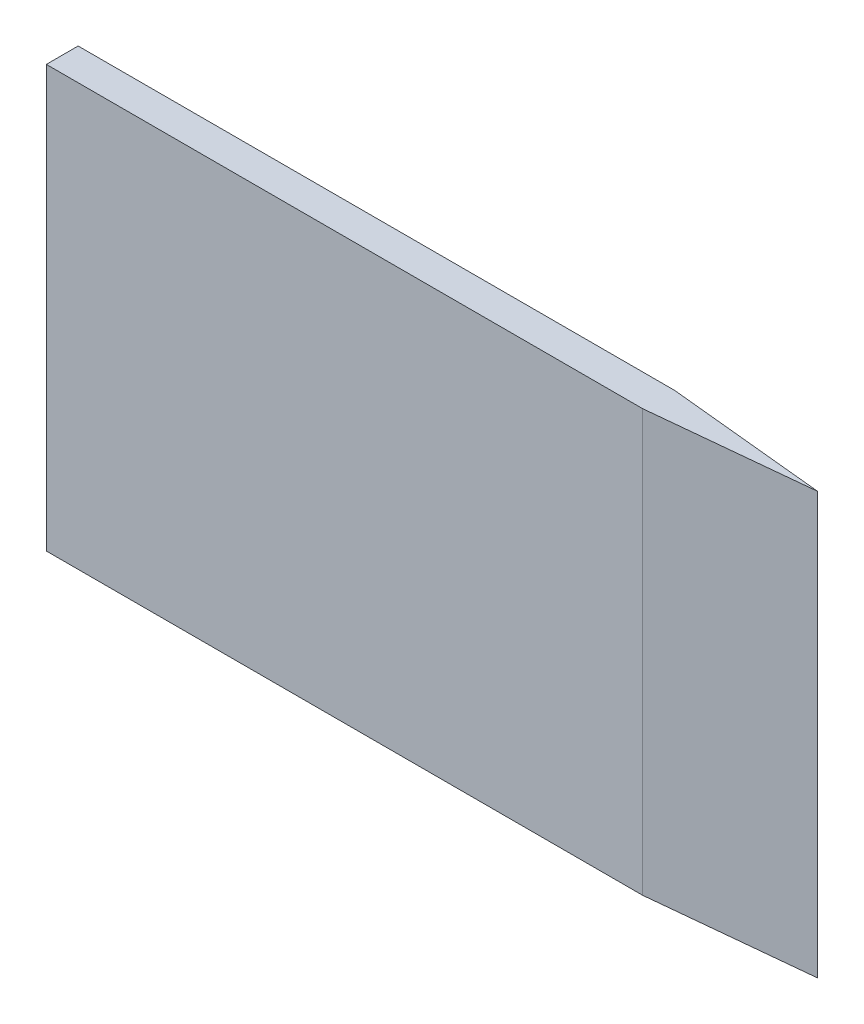
ISO-10303-21;
HEADER;
FILE_DESCRIPTION(('STEP AP214'),'2;1');
FILE_NAME('part.step','',(''),(''),'','','');
FILE_SCHEMA(('AUTOMOTIVE_DESIGN { 1 0 10303 214 1 1 1 1 }'));
ENDSEC;
DATA;
#1=APPLICATION_CONTEXT('core data for automotive mechanical design processes');
#2=APPLICATION_PROTOCOL_DEFINITION('international standard','automotive_design',2000,#1);
#3=PRODUCT_CONTEXT('',#1,'mechanical');
#4=PRODUCT('Part','Part','',(#3));
#5=PRODUCT_RELATED_PRODUCT_CATEGORY('part','',(#4));
#6=PRODUCT_DEFINITION_FORMATION('','',#4);
#7=PRODUCT_DEFINITION_CONTEXT('part definition',#1,'design');
#8=PRODUCT_DEFINITION('design','',#6,#7);
#9=PRODUCT_DEFINITION_SHAPE('','',#8);
#10=(LENGTH_UNIT() NAMED_UNIT(*) SI_UNIT(.MILLI.,.METRE.));
#11=(NAMED_UNIT(*) PLANE_ANGLE_UNIT() SI_UNIT($,.RADIAN.));
#12=(NAMED_UNIT(*) SI_UNIT($,.STERADIAN.) SOLID_ANGLE_UNIT());
#13=UNCERTAINTY_MEASURE_WITH_UNIT(LENGTH_MEASURE(1.E-05),#10,'distance_accuracy_value','');
#14=(GEOMETRIC_REPRESENTATION_CONTEXT(3) GLOBAL_UNCERTAINTY_ASSIGNED_CONTEXT((#13)) GLOBAL_UNIT_ASSIGNED_CONTEXT((#10,
#11,#12)) REPRESENTATION_CONTEXT('',''));
#15=CARTESIAN_POINT('',(0.,0.,0.));
#16=DIRECTION('',(0.,0.,1.));
#17=DIRECTION('',(1.,0.,0.));
#18=AXIS2_PLACEMENT_3D('',#15,#16,#17);
#19=CARTESIAN_POINT('',(47.5,169.197131606733,0.));
#20=DIRECTION('',(0.0995037190209989,0.,-0.995037190209989));
#21=DIRECTION('',(-0.995037190209989,0.,-0.0995037190209989));
#22=AXIS2_PLACEMENT_3D('',#19,#20,#21);
#23=PLANE('',#22);
#24=DIRECTION('',(0.,-1.,0.));
#25=VECTOR('',#24,1.);
#26=CARTESIAN_POINT('',(27.5,169.197131606733,-2.));
#27=LINE('',#26,#25);
#28=CARTESIAN_POINT('',(27.5,26.5,-2.));
#29=VERTEX_POINT('',#28);
#30=CARTESIAN_POINT('',(27.5,-26.5,-2.));
#31=VERTEX_POINT('',#30);
#32=EDGE_CURVE('E104',#29,#31,#27,.T.);
#33=ORIENTED_EDGE('',*,*,#32,.F.);
#34=DIRECTION('',(0.995037190209989,0.,0.0995037190209989));
#35=VECTOR('',#34,1.);
#36=CARTESIAN_POINT('',(-46.3613861386139,26.5,-9.38613861386139));
#37=LINE('',#36,#35);
#38=CARTESIAN_POINT('',(47.5,26.5,0.));
#39=VERTEX_POINT('',#38);
#40=EDGE_CURVE('E102',#29,#39,#37,.T.);
#41=ORIENTED_EDGE('',*,*,#40,.T.);
#42=DIRECTION('',(0.,-1.,0.));
#43=VECTOR('',#42,1.);
#44=CARTESIAN_POINT('',(47.5,169.197131606733,0.));
#45=LINE('',#44,#43);
#46=CARTESIAN_POINT('',(47.5,-26.5,0.));
#47=VERTEX_POINT('',#46);
#48=EDGE_CURVE('E100',#39,#47,#45,.T.);
#49=ORIENTED_EDGE('',*,*,#48,.T.);
#50=DIRECTION('',(-0.995037190209989,0.,-0.0995037190209989));
#51=VECTOR('',#50,1.);
#52=CARTESIAN_POINT('',(-46.3613861386139,-26.5,-9.38613861386139));
#53=LINE('',#52,#51);
#54=EDGE_CURVE('E11',#47,#31,#53,.T.);
#55=ORIENTED_EDGE('',*,*,#54,.T.);
#56=EDGE_LOOP('',(#33,#41,#49,#55));
#57=FACE_BOUND('',#56,.T.);
#58=ADVANCED_FACE('F41',(#57),#23,.T.);
#59=CARTESIAN_POINT('',(47.5,169.197131606733,0.));
#60=DIRECTION('',(0.0995037190209989,0.,0.995037190209989));
#61=DIRECTION('',(0.995037190209989,0.,-0.0995037190209989));
#62=AXIS2_PLACEMENT_3D('',#59,#60,#61);
#63=PLANE('',#62);
#64=ORIENTED_EDGE('',*,*,#48,.F.);
#65=DIRECTION('',(-0.995037190209989,0.,0.0995037190209989));
#66=VECTOR('',#65,1.);
#67=CARTESIAN_POINT('',(-46.7574257425743,26.5,9.42574257425743));
#68=LINE('',#67,#66);
#69=CARTESIAN_POINT('',(27.5,26.5,2.));
#70=VERTEX_POINT('',#69);
#71=EDGE_CURVE('E56',#39,#70,#68,.T.);
#72=ORIENTED_EDGE('',*,*,#71,.T.);
#73=DIRECTION('',(0.,-1.,0.));
#74=VECTOR('',#73,1.);
#75=CARTESIAN_POINT('',(27.5,169.197131606733,2.));
#76=LINE('',#75,#74);
#77=CARTESIAN_POINT('',(27.5,-26.5,2.));
#78=VERTEX_POINT('',#77);
#79=EDGE_CURVE('E64',#70,#78,#76,.T.);
#80=ORIENTED_EDGE('',*,*,#79,.T.);
#81=DIRECTION('',(0.995037190209989,0.,-0.0995037190209989));
#82=VECTOR('',#81,1.);
#83=CARTESIAN_POINT('',(-46.7574257425743,-26.5,9.42574257425743));
#84=LINE('',#83,#82);
#85=EDGE_CURVE('E49',#78,#47,#84,.T.);
#86=ORIENTED_EDGE('',*,*,#85,.T.);
#87=EDGE_LOOP('',(#64,#72,#80,#86));
#88=FACE_BOUND('',#87,.T.);
#89=ADVANCED_FACE('F99',(#88),#63,.T.);
#90=CARTESIAN_POINT('',(0.,0.,2.));
#91=DIRECTION('',(0.,0.,-1.));
#92=DIRECTION('',(-1.,0.,0.));
#93=AXIS2_PLACEMENT_3D('',#90,#91,#92);
#94=PLANE('',#93);
#95=ORIENTED_EDGE('',*,*,#79,.F.);
#96=DIRECTION('',(-1.,0.,0.));
#97=VECTOR('',#96,1.);
#98=CARTESIAN_POINT('',(-47.5,26.5,2.));
#99=LINE('',#98,#97);
#100=CARTESIAN_POINT('',(-47.5,26.5,2.));
#101=VERTEX_POINT('',#100);
#102=EDGE_CURVE('E111',#70,#101,#99,.T.);
#103=ORIENTED_EDGE('',*,*,#102,.T.);
#104=DIRECTION('',(0.,-1.,0.));
#105=VECTOR('',#104,1.);
#106=CARTESIAN_POINT('',(-47.5,-26.5,2.));
#107=LINE('',#106,#105);
#108=CARTESIAN_POINT('',(-47.5,-26.5,2.));
#109=VERTEX_POINT('',#108);
#110=EDGE_CURVE('E113',#101,#109,#107,.T.);
#111=ORIENTED_EDGE('',*,*,#110,.T.);
#112=DIRECTION('',(1.,0.,0.));
#113=VECTOR('',#112,1.);
#114=CARTESIAN_POINT('',(-47.5,-26.5,2.));
#115=LINE('',#114,#113);
#116=EDGE_CURVE('E115',#109,#78,#115,.T.);
#117=ORIENTED_EDGE('',*,*,#116,.T.);
#118=EDGE_LOOP('',(#95,#103,#111,#117));
#119=FACE_BOUND('',#118,.T.);
#120=ADVANCED_FACE('F139',(#119),#94,.F.);
#121=CARTESIAN_POINT('',(0.,0.,-2.));
#122=DIRECTION('',(0.,0.,-1.));
#123=DIRECTION('',(-1.,0.,0.));
#124=AXIS2_PLACEMENT_3D('',#121,#122,#123);
#125=PLANE('',#124);
#126=DIRECTION('',(-1.,0.,0.));
#127=VECTOR('',#126,1.);
#128=CARTESIAN_POINT('',(-47.5,26.5,-2.));
#129=LINE('',#128,#127);
#130=CARTESIAN_POINT('',(-47.5,26.5,-2.));
#131=VERTEX_POINT('',#130);
#132=EDGE_CURVE('E110',#29,#131,#129,.T.);
#133=ORIENTED_EDGE('',*,*,#132,.F.);
#134=ORIENTED_EDGE('',*,*,#32,.T.);
#135=DIRECTION('',(1.,0.,0.));
#136=VECTOR('',#135,1.);
#137=CARTESIAN_POINT('',(-47.5,-26.5,-2.));
#138=LINE('',#137,#136);
#139=CARTESIAN_POINT('',(-47.5,-26.5,-2.));
#140=VERTEX_POINT('',#139);
#141=EDGE_CURVE('E93',#140,#31,#138,.T.);
#142=ORIENTED_EDGE('',*,*,#141,.F.);
#143=DIRECTION('',(0.,-1.,0.));
#144=VECTOR('',#143,1.);
#145=CARTESIAN_POINT('',(-47.5,-26.5,-2.));
#146=LINE('',#145,#144);
#147=EDGE_CURVE('E119',#131,#140,#146,.T.);
#148=ORIENTED_EDGE('',*,*,#147,.F.);
#149=EDGE_LOOP('',(#133,#134,#142,#148));
#150=FACE_BOUND('',#149,.T.);
#151=ADVANCED_FACE('F132',(#150),#125,.T.);
#152=CARTESIAN_POINT('',(-47.5,26.5,2.));
#153=DIRECTION('',(0.,-1.,0.));
#154=DIRECTION('',(1.,0.,0.));
#155=AXIS2_PLACEMENT_3D('',#152,#153,#154);
#156=PLANE('',#155);
#157=ORIENTED_EDGE('',*,*,#40,.F.);
#158=ORIENTED_EDGE('',*,*,#132,.T.);
#159=DIRECTION('',(0.,0.,-1.));
#160=VECTOR('',#159,1.);
#161=CARTESIAN_POINT('',(-47.5,26.5,2.));
#162=LINE('',#161,#160);
#163=EDGE_CURVE('E101',#101,#131,#162,.T.);
#164=ORIENTED_EDGE('',*,*,#163,.F.);
#165=ORIENTED_EDGE('',*,*,#102,.F.);
#166=ORIENTED_EDGE('',*,*,#71,.F.);
#167=EDGE_LOOP('',(#157,#158,#164,#165,#166));
#168=FACE_BOUND('',#167,.T.);
#169=ADVANCED_FACE('F43',(#168),#156,.F.);
#170=CARTESIAN_POINT('',(-47.5,-26.5,2.));
#171=DIRECTION('',(0.,1.,0.));
#172=DIRECTION('',(0.,0.,1.));
#173=AXIS2_PLACEMENT_3D('',#170,#171,#172);
#174=PLANE('',#173);
#175=ORIENTED_EDGE('',*,*,#54,.F.);
#176=ORIENTED_EDGE('',*,*,#85,.F.);
#177=ORIENTED_EDGE('',*,*,#116,.F.);
#178=DIRECTION('',(0.,0.,-1.));
#179=VECTOR('',#178,1.);
#180=CARTESIAN_POINT('',(-47.5,-26.5,2.));
#181=LINE('',#180,#179);
#182=EDGE_CURVE('E117',#109,#140,#181,.T.);
#183=ORIENTED_EDGE('',*,*,#182,.T.);
#184=ORIENTED_EDGE('',*,*,#141,.T.);
#185=EDGE_LOOP('',(#175,#176,#177,#183,#184));
#186=FACE_BOUND('',#185,.T.);
#187=ADVANCED_FACE('F89',(#186),#174,.F.);
#188=CARTESIAN_POINT('',(-47.5,-26.5,2.));
#189=DIRECTION('',(1.,0.,0.));
#190=DIRECTION('',(0.,0.,-1.));
#191=AXIS2_PLACEMENT_3D('',#188,#189,#190);
#192=PLANE('',#191);
#193=ORIENTED_EDGE('',*,*,#147,.T.);
#194=ORIENTED_EDGE('',*,*,#182,.F.);
#195=ORIENTED_EDGE('',*,*,#110,.F.);
#196=ORIENTED_EDGE('',*,*,#163,.T.);
#197=EDGE_LOOP('',(#193,#194,#195,#196));
#198=FACE_BOUND('',#197,.T.);
#199=ADVANCED_FACE('F128',(#198),#192,.F.);
#200=CLOSED_SHELL('',(#58,#89,#120,#151,#169,#187,#199));
#201=MANIFOLD_SOLID_BREP('B2',#200);
#202=ADVANCED_BREP_SHAPE_REPRESENTATION('',(#18,#201),#14);
#203=SHAPE_DEFINITION_REPRESENTATION(#9,#202);
ENDSEC;
END-ISO-10303-21;
